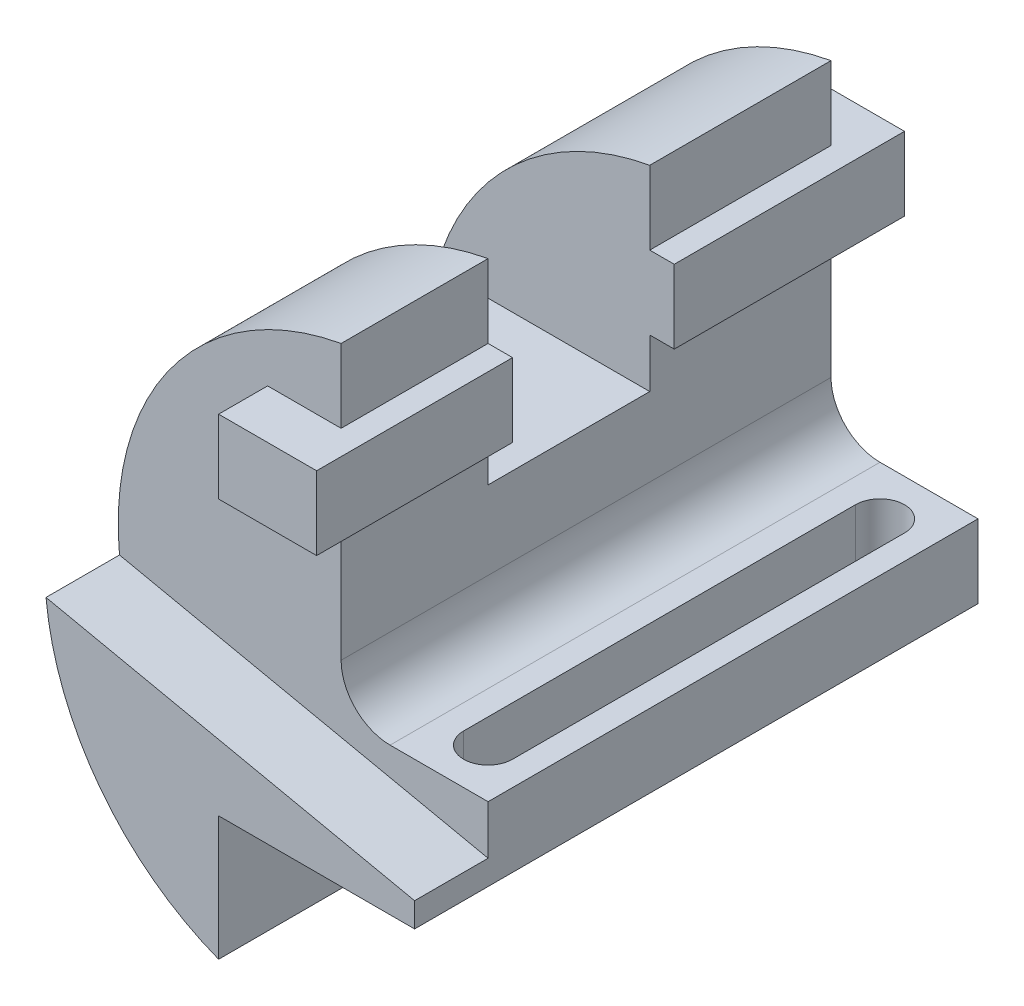
ISO-10303-21;
HEADER;
FILE_DESCRIPTION(('STEP AP214'),'2;1');
FILE_NAME('part.step','',(''),(''),'','','');
FILE_SCHEMA(('AUTOMOTIVE_DESIGN { 1 0 10303 214 1 1 1 1 }'));
ENDSEC;
DATA;
#1=APPLICATION_CONTEXT('core data for automotive mechanical design processes');
#2=APPLICATION_PROTOCOL_DEFINITION('international standard','automotive_design',2000,#1);
#3=PRODUCT_CONTEXT('',#1,'mechanical');
#4=PRODUCT('Part','Part','',(#3));
#5=PRODUCT_RELATED_PRODUCT_CATEGORY('part','',(#4));
#6=PRODUCT_DEFINITION_FORMATION('','',#4);
#7=PRODUCT_DEFINITION_CONTEXT('part definition',#1,'design');
#8=PRODUCT_DEFINITION('design','',#6,#7);
#9=PRODUCT_DEFINITION_SHAPE('','',#8);
#10=(LENGTH_UNIT() NAMED_UNIT(*) SI_UNIT(.MILLI.,.METRE.));
#11=(NAMED_UNIT(*) PLANE_ANGLE_UNIT() SI_UNIT($,.RADIAN.));
#12=(NAMED_UNIT(*) SI_UNIT($,.STERADIAN.) SOLID_ANGLE_UNIT());
#13=UNCERTAINTY_MEASURE_WITH_UNIT(LENGTH_MEASURE(1.E-05),#10,'distance_accuracy_value','');
#14=(GEOMETRIC_REPRESENTATION_CONTEXT(3) GLOBAL_UNCERTAINTY_ASSIGNED_CONTEXT((#13)) GLOBAL_UNIT_ASSIGNED_CONTEXT((#10,
#11,#12)) REPRESENTATION_CONTEXT('',''));
#15=CARTESIAN_POINT('',(0.,0.,0.));
#16=DIRECTION('',(0.,0.,1.));
#17=DIRECTION('',(1.,0.,0.));
#18=AXIS2_PLACEMENT_3D('',#15,#16,#17);
#19=CARTESIAN_POINT('',(-30.,15.,115.));
#20=DIRECTION('',(-1.,0.,0.));
#21=DIRECTION('',(0.,-1.,0.));
#22=AXIS2_PLACEMENT_3D('',#19,#20,#21);
#23=PLANE('',#22);
#24=DIRECTION('',(0.,0.,1.));
#25=VECTOR('',#24,1.);
#26=CARTESIAN_POINT('',(-30.,66.,115.));
#27=LINE('',#26,#25);
#28=CARTESIAN_POINT('',(-30.,66.,70.));
#29=VERTEX_POINT('',#28);
#30=CARTESIAN_POINT('',(-30.,66.,100.));
#31=VERTEX_POINT('',#30);
#32=EDGE_CURVE('E334',#29,#31,#27,.T.);
#33=ORIENTED_EDGE('',*,*,#32,.F.);
#34=DIRECTION('',(0.,1.,0.));
#35=VECTOR('',#34,1.);
#36=CARTESIAN_POINT('',(-30.,15.,70.));
#37=LINE('',#36,#35);
#38=CARTESIAN_POINT('',(-29.9999999999999,81.,70.));
#39=VERTEX_POINT('',#38);
#40=EDGE_CURVE('E285',#29,#39,#37,.T.);
#41=ORIENTED_EDGE('',*,*,#40,.T.);
#42=DIRECTION('',(0.,0.,-1.));
#43=VECTOR('',#42,1.);
#44=CARTESIAN_POINT('',(-30.,81.,115.));
#45=LINE('',#44,#43);
#46=CARTESIAN_POINT('',(-30.,81.,100.));
#47=VERTEX_POINT('',#46);
#48=EDGE_CURVE('E399',#47,#39,#45,.T.);
#49=ORIENTED_EDGE('',*,*,#48,.F.);
#50=DIRECTION('',(0.,1.,0.));
#51=VECTOR('',#50,1.);
#52=CARTESIAN_POINT('',(-30.,15.,100.));
#53=LINE('',#52,#51);
#54=EDGE_CURVE('E353',#31,#47,#53,.T.);
#55=ORIENTED_EDGE('',*,*,#54,.F.);
#56=EDGE_LOOP('',(#33,#41,#49,#55));
#57=FACE_BOUND('',#56,.T.);
#58=ADVANCED_FACE('F39',(#57),#23,.F.);
#59=CARTESIAN_POINT('',(-25.,51.,-10.));
#60=DIRECTION('',(0.,1.,0.));
#61=DIRECTION('',(-1.,0.,0.));
#62=AXIS2_PLACEMENT_3D('',#59,#60,#61);
#63=PLANE('',#62);
#64=DIRECTION('',(0.,0.,-1.));
#65=VECTOR('',#64,1.);
#66=CARTESIAN_POINT('',(-30.,51.,115.));
#67=LINE('',#66,#65);
#68=CARTESIAN_POINT('',(-30.,51.,100.));
#69=VERTEX_POINT('',#68);
#70=CARTESIAN_POINT('',(-30.,51.,70.));
#71=VERTEX_POINT('',#70);
#72=EDGE_CURVE('E343',#69,#71,#67,.T.);
#73=ORIENTED_EDGE('',*,*,#72,.T.);
#74=DIRECTION('',(1.,0.,0.));
#75=VECTOR('',#74,1.);
#76=CARTESIAN_POINT('',(-25.,51.,70.));
#77=LINE('',#76,#75);
#78=CARTESIAN_POINT('',(-25.,51.,70.));
#79=VERTEX_POINT('',#78);
#80=EDGE_CURVE('E282',#71,#79,#77,.T.);
#81=ORIENTED_EDGE('',*,*,#80,.T.);
#82=DIRECTION('',(0.,0.,1.));
#83=VECTOR('',#82,1.);
#84=CARTESIAN_POINT('',(-25.,51.,-10.));
#85=LINE('',#84,#83);
#86=CARTESIAN_POINT('',(-25.,51.,110.));
#87=VERTEX_POINT('',#86);
#88=EDGE_CURVE('E330',#79,#87,#85,.T.);
#89=ORIENTED_EDGE('',*,*,#88,.T.);
#90=DIRECTION('',(-1.,0.,0.));
#91=VECTOR('',#90,1.);
#92=CARTESIAN_POINT('',(-25.,51.,110.));
#93=LINE('',#92,#91);
#94=CARTESIAN_POINT('',(-45.,51.,110.));
#95=VERTEX_POINT('',#94);
#96=EDGE_CURVE('E297',#87,#95,#93,.T.);
#97=ORIENTED_EDGE('',*,*,#96,.T.);
#98=DIRECTION('',(0.,0.,1.));
#99=VECTOR('',#98,1.);
#100=CARTESIAN_POINT('',(-45.,51.,-10.));
#101=LINE('',#100,#99);
#102=CARTESIAN_POINT('',(-45.,51.,100.));
#103=VERTEX_POINT('',#102);
#104=EDGE_CURVE('E326',#103,#95,#101,.T.);
#105=ORIENTED_EDGE('',*,*,#104,.F.);
#106=DIRECTION('',(-1.,0.,0.));
#107=VECTOR('',#106,1.);
#108=CARTESIAN_POINT('',(-20.,51.,100.));
#109=LINE('',#108,#107);
#110=EDGE_CURVE('E413',#69,#103,#109,.T.);
#111=ORIENTED_EDGE('',*,*,#110,.F.);
#112=EDGE_LOOP('',(#73,#81,#89,#97,#105,#111));
#113=FACE_BOUND('',#112,.T.);
#114=ADVANCED_FACE('F509',(#113),#63,.F.);
#115=CARTESIAN_POINT('',(-25.,66.,-10.));
#116=DIRECTION('',(0.,-1.,0.));
#117=DIRECTION('',(0.,0.,-1.));
#118=AXIS2_PLACEMENT_3D('',#115,#116,#117);
#119=PLANE('',#118);
#120=DIRECTION('',(0.,0.,1.));
#121=VECTOR('',#120,1.);
#122=CARTESIAN_POINT('',(-25.,66.,-10.));
#123=LINE('',#122,#121);
#124=CARTESIAN_POINT('',(-25.,66.,70.));
#125=VERTEX_POINT('',#124);
#126=CARTESIAN_POINT('',(-25.,66.,110.));
#127=VERTEX_POINT('',#126);
#128=EDGE_CURVE('E318',#125,#127,#123,.T.);
#129=ORIENTED_EDGE('',*,*,#128,.F.);
#130=DIRECTION('',(-1.,0.,0.));
#131=VECTOR('',#130,1.);
#132=CARTESIAN_POINT('',(-25.,66.,70.));
#133=LINE('',#132,#131);
#134=EDGE_CURVE('E279',#125,#29,#133,.T.);
#135=ORIENTED_EDGE('',*,*,#134,.T.);
#136=ORIENTED_EDGE('',*,*,#32,.T.);
#137=DIRECTION('',(1.,0.,0.));
#138=VECTOR('',#137,1.);
#139=CARTESIAN_POINT('',(-20.,66.,100.));
#140=LINE('',#139,#138);
#141=CARTESIAN_POINT('',(-45.,66.,100.));
#142=VERTEX_POINT('',#141);
#143=EDGE_CURVE('E407',#142,#31,#140,.T.);
#144=ORIENTED_EDGE('',*,*,#143,.F.);
#145=DIRECTION('',(0.,0.,1.));
#146=VECTOR('',#145,1.);
#147=CARTESIAN_POINT('',(-45.,66.,-10.));
#148=LINE('',#147,#146);
#149=CARTESIAN_POINT('',(-45.,66.,110.));
#150=VERTEX_POINT('',#149);
#151=EDGE_CURVE('E322',#142,#150,#148,.T.);
#152=ORIENTED_EDGE('',*,*,#151,.T.);
#153=DIRECTION('',(1.,0.,0.));
#154=VECTOR('',#153,1.);
#155=CARTESIAN_POINT('',(-25.,66.,110.));
#156=LINE('',#155,#154);
#157=EDGE_CURVE('E305',#150,#127,#156,.T.);
#158=ORIENTED_EDGE('',*,*,#157,.T.);
#159=EDGE_LOOP('',(#129,#135,#136,#144,#152,#158));
#160=FACE_BOUND('',#159,.T.);
#161=ADVANCED_FACE('F515',(#160),#119,.F.);
#162=CARTESIAN_POINT('',(-25.,66.,-10.));
#163=DIRECTION('',(-1.,0.,0.));
#164=DIRECTION('',(0.,-1.,0.));
#165=AXIS2_PLACEMENT_3D('',#162,#163,#164);
#166=PLANE('',#165);
#167=ORIENTED_EDGE('',*,*,#88,.F.);
#168=DIRECTION('',(0.,1.,0.));
#169=VECTOR('',#168,1.);
#170=CARTESIAN_POINT('',(-25.,66.,70.));
#171=LINE('',#170,#169);
#172=EDGE_CURVE('E419',#79,#125,#171,.T.);
#173=ORIENTED_EDGE('',*,*,#172,.T.);
#174=ORIENTED_EDGE('',*,*,#128,.T.);
#175=DIRECTION('',(0.,-1.,0.));
#176=VECTOR('',#175,1.);
#177=CARTESIAN_POINT('',(-25.,66.,110.));
#178=LINE('',#177,#176);
#179=EDGE_CURVE('E301',#127,#87,#178,.T.);
#180=ORIENTED_EDGE('',*,*,#179,.T.);
#181=EDGE_LOOP('',(#167,#173,#174,#180));
#182=FACE_BOUND('',#181,.T.);
#183=ADVANCED_FACE('F523',(#182),#166,.F.);
#184=CARTESIAN_POINT('',(-30.,25.,100.));
#185=VERTEX_POINT('',#184);
#186=EDGE_CURVE('E354',#185,#69,#53,.T.);
#187=ORIENTED_EDGE('',*,*,#186,.F.);
#188=DIRECTION('',(0.,0.,-1.));
#189=VECTOR('',#188,1.);
#190=CARTESIAN_POINT('',(-30.,25.,0.));
#191=LINE('',#190,#189);
#192=CARTESIAN_POINT('',(-30.,25.,0.));
#193=VERTEX_POINT('',#192);
#194=EDGE_CURVE('E434',#185,#193,#191,.T.);
#195=ORIENTED_EDGE('',*,*,#194,.T.);
#196=DIRECTION('',(0.,1.,0.));
#197=VECTOR('',#196,1.);
#198=CARTESIAN_POINT('',(-30.,15.,0.));
#199=LINE('',#198,#197);
#200=CARTESIAN_POINT('',(-30.,51.,0.));
#201=VERTEX_POINT('',#200);
#202=EDGE_CURVE('E388',#193,#201,#199,.T.);
#203=ORIENTED_EDGE('',*,*,#202,.T.);
#204=CARTESIAN_POINT('',(-30.,51.,37.));
#205=VERTEX_POINT('',#204);
#206=EDGE_CURVE('E342',#205,#201,#67,.T.);
#207=ORIENTED_EDGE('',*,*,#206,.F.);
#208=DIRECTION('',(0.,-1.,0.));
#209=VECTOR('',#208,1.);
#210=CARTESIAN_POINT('',(-30.,15.,37.));
#211=LINE('',#210,#209);
#212=CARTESIAN_POINT('',(-30.,41.,37.));
#213=VERTEX_POINT('',#212);
#214=EDGE_CURVE('E273',#205,#213,#211,.T.);
#215=ORIENTED_EDGE('',*,*,#214,.T.);
#216=DIRECTION('',(0.,0.,1.));
#217=VECTOR('',#216,1.);
#218=CARTESIAN_POINT('',(-30.,41.,115.));
#219=LINE('',#218,#217);
#220=CARTESIAN_POINT('',(-30.,41.,70.));
#221=VERTEX_POINT('',#220);
#222=EDGE_CURVE('E294',#213,#221,#219,.T.);
#223=ORIENTED_EDGE('',*,*,#222,.T.);
#224=DIRECTION('',(0.,1.,0.));
#225=VECTOR('',#224,1.);
#226=CARTESIAN_POINT('',(-30.,15.,70.));
#227=LINE('',#226,#225);
#228=EDGE_CURVE('E288',#221,#71,#227,.T.);
#229=ORIENTED_EDGE('',*,*,#228,.T.);
#230=ORIENTED_EDGE('',*,*,#72,.F.);
#231=EDGE_LOOP('',(#187,#195,#203,#207,#215,#223,#229,#230));
#232=FACE_BOUND('',#231,.T.);
#233=ADVANCED_FACE('F440',(#232),#23,.F.);
#234=CARTESIAN_POINT('',(-29.9999999999999,81.,37.));
#235=VERTEX_POINT('',#234);
#236=CARTESIAN_POINT('',(-30.,81.,0.));
#237=VERTEX_POINT('',#236);
#238=EDGE_CURVE('E398',#235,#237,#45,.T.);
#239=ORIENTED_EDGE('',*,*,#238,.F.);
#240=DIRECTION('',(0.,-1.,0.));
#241=VECTOR('',#240,1.);
#242=CARTESIAN_POINT('',(-30.,15.,37.));
#243=LINE('',#242,#241);
#244=CARTESIAN_POINT('',(-30.,66.,37.));
#245=VERTEX_POINT('',#244);
#246=EDGE_CURVE('E270',#235,#245,#243,.T.);
#247=ORIENTED_EDGE('',*,*,#246,.T.);
#248=CARTESIAN_POINT('',(-30.,66.,0.));
#249=VERTEX_POINT('',#248);
#250=EDGE_CURVE('E335',#249,#245,#27,.T.);
#251=ORIENTED_EDGE('',*,*,#250,.F.);
#252=EDGE_CURVE('E387',#249,#237,#199,.T.);
#253=ORIENTED_EDGE('',*,*,#252,.T.);
#254=EDGE_LOOP('',(#239,#247,#251,#253));
#255=FACE_BOUND('',#254,.T.);
#256=ADVANCED_FACE('F474',(#255),#23,.F.);
#257=CARTESIAN_POINT('',(-20.,26.4083339693685,0.));
#258=DIRECTION('',(0.,0.,1.));
#259=DIRECTION('',(1.,0.,0.));
#260=AXIS2_PLACEMENT_3D('',#257,#258,#259);
#261=PLANE('',#260);
#262=DIRECTION('',(-1.,0.,0.));
#263=VECTOR('',#262,1.);
#264=CARTESIAN_POINT('',(-20.,51.,0.));
#265=LINE('',#264,#263);
#266=CARTESIAN_POINT('',(-45.,51.,0.));
#267=VERTEX_POINT('',#266);
#268=EDGE_CURVE('E346',#201,#267,#265,.T.);
#269=ORIENTED_EDGE('',*,*,#268,.F.);
#270=ORIENTED_EDGE('',*,*,#202,.F.);
#271=CARTESIAN_POINT('',(-20.,25.,0.));
#272=DIRECTION('',(0.,0.,1.));
#273=DIRECTION('',(1.,0.,0.));
#274=AXIS2_PLACEMENT_3D('',#271,#272,#273);
#275=CIRCLE('',#274,10.);
#276=CARTESIAN_POINT('',(-20.,15.,0.));
#277=VERTEX_POINT('',#276);
#278=EDGE_CURVE('E47',#193,#277,#275,.T.);
#279=ORIENTED_EDGE('',*,*,#278,.T.);
#280=DIRECTION('',(-1.,0.,0.));
#281=VECTOR('',#280,1.);
#282=CARTESIAN_POINT('',(0.,15.,0.));
#283=LINE('',#282,#281);
#284=CARTESIAN_POINT('',(0.,15.,0.));
#285=VERTEX_POINT('',#284);
#286=EDGE_CURVE('E385',#285,#277,#283,.T.);
#287=ORIENTED_EDGE('',*,*,#286,.F.);
#288=DIRECTION('',(0.,1.,0.));
#289=VECTOR('',#288,1.);
#290=CARTESIAN_POINT('',(0.,0.,0.));
#291=LINE('',#290,#289);
#292=CARTESIAN_POINT('',(0.,0.,0.));
#293=VERTEX_POINT('',#292);
#294=EDGE_CURVE('E382',#293,#285,#291,.T.);
#295=ORIENTED_EDGE('',*,*,#294,.F.);
#296=DIRECTION('',(1.,0.,0.));
#297=VECTOR('',#296,1.);
#298=CARTESIAN_POINT('',(0.,0.,0.));
#299=LINE('',#298,#297);
#300=CARTESIAN_POINT('',(-40.,0.,0.));
#301=VERTEX_POINT('',#300);
#302=EDGE_CURVE('E366',#301,#293,#299,.T.);
#303=ORIENTED_EDGE('',*,*,#302,.F.);
#304=DIRECTION('',(0.,1.,0.));
#305=VECTOR('',#304,1.);
#306=CARTESIAN_POINT('',(-40.,0.,0.));
#307=LINE('',#306,#305);
#308=CARTESIAN_POINT('',(-40.,-25.3627969821569,0.));
#309=VERTEX_POINT('',#308);
#310=EDGE_CURVE('E372',#309,#301,#307,.T.);
#311=ORIENTED_EDGE('',*,*,#310,.F.);
#312=CARTESIAN_POINT('',(-20.,26.4083339693685,0.));
#313=DIRECTION('',(0.,0.,1.));
#314=DIRECTION('',(1.,0.,0.));
#315=AXIS2_PLACEMENT_3D('',#312,#313,#314);
#316=CIRCLE('',#315,55.5);
#317=EDGE_CURVE('E390',#237,#309,#316,.T.);
#318=ORIENTED_EDGE('',*,*,#317,.F.);
#319=ORIENTED_EDGE('',*,*,#252,.F.);
#320=DIRECTION('',(1.,0.,0.));
#321=VECTOR('',#320,1.);
#322=CARTESIAN_POINT('',(-20.,66.,0.));
#323=LINE('',#322,#321);
#324=CARTESIAN_POINT('',(-45.,66.,0.));
#325=VERTEX_POINT('',#324);
#326=EDGE_CURVE('E338',#325,#249,#323,.T.);
#327=ORIENTED_EDGE('',*,*,#326,.F.);
#328=DIRECTION('',(0.,1.,0.));
#329=VECTOR('',#328,1.);
#330=CARTESIAN_POINT('',(-45.,26.4083339693685,0.));
#331=LINE('',#330,#329);
#332=EDGE_CURVE('E340',#267,#325,#331,.T.);
#333=ORIENTED_EDGE('',*,*,#332,.F.);
#334=EDGE_LOOP('',(#269,#270,#279,#287,#295,#303,#311,#318,#319,#327,#333));
#335=FACE_BOUND('',#334,.T.);
#336=ADVANCED_FACE('F447',(#335),#261,.F.);
#337=CARTESIAN_POINT('',(-20.,26.4083339693685,100.));
#338=DIRECTION('',(0.,0.,1.));
#339=DIRECTION('',(1.,0.,0.));
#340=AXIS2_PLACEMENT_3D('',#337,#338,#339);
#341=PLANE('',#340);
#342=DIRECTION('',(-1.,0.,0.));
#343=VECTOR('',#342,1.);
#344=CARTESIAN_POINT('',(0.,15.,100.));
#345=LINE('',#344,#343);
#346=CARTESIAN_POINT('',(0.,15.,100.));
#347=VERTEX_POINT('',#346);
#348=CARTESIAN_POINT('',(-20.,15.,100.));
#349=VERTEX_POINT('',#348);
#350=EDGE_CURVE('E351',#347,#349,#345,.T.);
#351=ORIENTED_EDGE('',*,*,#350,.T.);
#352=CARTESIAN_POINT('',(-20.,25.,100.));
#353=DIRECTION('',(0.,0.,1.));
#354=DIRECTION('',(1.,0.,0.));
#355=AXIS2_PLACEMENT_3D('',#352,#353,#354);
#356=CIRCLE('',#355,10.);
#357=EDGE_CURVE('E12',#349,#185,#356,.F.);
#358=ORIENTED_EDGE('',*,*,#357,.T.);
#359=ORIENTED_EDGE('',*,*,#186,.T.);
#360=ORIENTED_EDGE('',*,*,#110,.T.);
#361=DIRECTION('',(0.,1.,0.));
#362=VECTOR('',#361,1.);
#363=CARTESIAN_POINT('',(-45.,26.4083339693685,100.));
#364=LINE('',#363,#362);
#365=EDGE_CURVE('E410',#103,#142,#364,.T.);
#366=ORIENTED_EDGE('',*,*,#365,.T.);
#367=ORIENTED_EDGE('',*,*,#143,.T.);
#368=ORIENTED_EDGE('',*,*,#54,.T.);
#369=CARTESIAN_POINT('',(-20.,26.4083339693685,100.));
#370=DIRECTION('',(0.,0.,1.));
#371=DIRECTION('',(1.,0.,0.));
#372=AXIS2_PLACEMENT_3D('',#369,#370,#371);
#373=CIRCLE('',#372,55.5);
#374=CARTESIAN_POINT('',(-75.2350441418964,20.9917022998936,100.));
#375=VERTEX_POINT('',#374);
#376=EDGE_CURVE('E356',#47,#375,#373,.T.);
#377=ORIENTED_EDGE('',*,*,#376,.T.);
#378=DIRECTION('',(0.978147600733806,-0.207911690817756,0.));
#379=VECTOR('',#378,1.);
#380=CARTESIAN_POINT('',(0.,5.,100.));
#381=LINE('',#380,#379);
#382=CARTESIAN_POINT('',(0.,5.,100.));
#383=VERTEX_POINT('',#382);
#384=EDGE_CURVE('E358',#375,#383,#381,.T.);
#385=ORIENTED_EDGE('',*,*,#384,.T.);
#386=DIRECTION('',(0.,1.,0.));
#387=VECTOR('',#386,1.);
#388=CARTESIAN_POINT('',(0.,5.,100.));
#389=LINE('',#388,#387);
#390=EDGE_CURVE('E349',#383,#347,#389,.T.);
#391=ORIENTED_EDGE('',*,*,#390,.T.);
#392=EDGE_LOOP('',(#351,#358,#359,#360,#366,#367,#368,#377,#385,#391));
#393=FACE_BOUND('',#392,.T.);
#394=ADVANCED_FACE('F499',(#393),#341,.T.);
#395=CARTESIAN_POINT('',(0.,15.,115.));
#396=DIRECTION('',(0.,-1.,0.));
#397=DIRECTION('',(1.,0.,0.));
#398=AXIS2_PLACEMENT_3D('',#395,#396,#397);
#399=PLANE('',#398);
#400=DIRECTION('',(0.,0.,1.));
#401=VECTOR('',#400,1.);
#402=CARTESIAN_POINT('',(-15.,15.,10.));
#403=LINE('',#402,#401);
#404=CARTESIAN_POINT('',(-15.,15.,10.));
#405=VERTEX_POINT('',#404);
#406=CARTESIAN_POINT('',(-15.,15.,90.));
#407=VERTEX_POINT('',#406);
#408=EDGE_CURVE('E240',#405,#407,#403,.T.);
#409=ORIENTED_EDGE('',*,*,#408,.F.);
#410=CARTESIAN_POINT('',(-10.,15.,10.));
#411=DIRECTION('',(0.,1.,0.));
#412=DIRECTION('',(-1.,0.,0.));
#413=AXIS2_PLACEMENT_3D('',#410,#411,#412);
#414=CIRCLE('',#413,5.);
#415=CARTESIAN_POINT('',(-5.,15.,10.));
#416=VERTEX_POINT('',#415);
#417=EDGE_CURVE('E245',#416,#405,#414,.T.);
#418=ORIENTED_EDGE('',*,*,#417,.F.);
#419=DIRECTION('',(0.,0.,-1.));
#420=VECTOR('',#419,1.);
#421=CARTESIAN_POINT('',(-5.,15.,10.));
#422=LINE('',#421,#420);
#423=CARTESIAN_POINT('',(-5.00000000000001,15.,90.));
#424=VERTEX_POINT('',#423);
#425=EDGE_CURVE('E249',#424,#416,#422,.T.);
#426=ORIENTED_EDGE('',*,*,#425,.F.);
#427=CARTESIAN_POINT('',(-10.,15.,90.));
#428=DIRECTION('',(0.,1.,0.));
#429=DIRECTION('',(-1.,0.,0.));
#430=AXIS2_PLACEMENT_3D('',#427,#428,#429);
#431=CIRCLE('',#430,5.);
#432=EDGE_CURVE('E229',#407,#424,#431,.T.);
#433=ORIENTED_EDGE('',*,*,#432,.F.);
#434=EDGE_LOOP('',(#409,#418,#426,#433));
#435=FACE_BOUND('',#434,.T.);
#436=ORIENTED_EDGE('',*,*,#286,.T.);
#437=DIRECTION('',(0.,0.,-1.));
#438=VECTOR('',#437,1.);
#439=CARTESIAN_POINT('',(-20.,15.,100.));
#440=LINE('',#439,#438);
#441=EDGE_CURVE('E60',#277,#349,#440,.F.);
#442=ORIENTED_EDGE('',*,*,#441,.T.);
#443=ORIENTED_EDGE('',*,*,#350,.F.);
#444=DIRECTION('',(0.,0.,-1.));
#445=VECTOR('',#444,1.);
#446=CARTESIAN_POINT('',(0.,15.,115.));
#447=LINE('',#446,#445);
#448=EDGE_CURVE('E402',#347,#285,#447,.T.);
#449=ORIENTED_EDGE('',*,*,#448,.T.);
#450=EDGE_LOOP('',(#436,#442,#443,#449));
#451=FACE_BOUND('',#450,.T.);
#452=ADVANCED_FACE('F247',(#435,#451),#399,.F.);
#453=CARTESIAN_POINT('',(0.,0.,115.));
#454=DIRECTION('',(0.,1.,0.));
#455=DIRECTION('',(-1.,0.,0.));
#456=AXIS2_PLACEMENT_3D('',#453,#454,#455);
#457=PLANE('',#456);
#458=DIRECTION('',(0.,0.,-1.));
#459=VECTOR('',#458,1.);
#460=CARTESIAN_POINT('',(-5.00000000000001,0.,115.));
#461=LINE('',#460,#459);
#462=CARTESIAN_POINT('',(-5.00000000000001,0.,90.));
#463=VERTEX_POINT('',#462);
#464=CARTESIAN_POINT('',(-5.,0.,10.));
#465=VERTEX_POINT('',#464);
#466=EDGE_CURVE('E428',#463,#465,#461,.T.);
#467=ORIENTED_EDGE('',*,*,#466,.T.);
#468=CARTESIAN_POINT('',(-10.,0.,10.));
#469=DIRECTION('',(0.,1.,0.));
#470=DIRECTION('',(-1.,0.,0.));
#471=AXIS2_PLACEMENT_3D('',#468,#469,#470);
#472=CIRCLE('',#471,5.);
#473=CARTESIAN_POINT('',(-15.,0.,10.));
#474=VERTEX_POINT('',#473);
#475=EDGE_CURVE('E431',#465,#474,#472,.T.);
#476=ORIENTED_EDGE('',*,*,#475,.T.);
#477=DIRECTION('',(0.,0.,1.));
#478=VECTOR('',#477,1.);
#479=CARTESIAN_POINT('',(-15.,0.,115.));
#480=LINE('',#479,#478);
#481=CARTESIAN_POINT('',(-15.,0.,90.));
#482=VERTEX_POINT('',#481);
#483=EDGE_CURVE('E425',#474,#482,#480,.T.);
#484=ORIENTED_EDGE('',*,*,#483,.T.);
#485=CARTESIAN_POINT('',(-10.,0.,90.));
#486=DIRECTION('',(0.,1.,0.));
#487=DIRECTION('',(-1.,0.,0.));
#488=AXIS2_PLACEMENT_3D('',#485,#486,#487);
#489=CIRCLE('',#488,5.);
#490=EDGE_CURVE('E232',#482,#463,#489,.T.);
#491=ORIENTED_EDGE('',*,*,#490,.T.);
#492=EDGE_LOOP('',(#467,#476,#484,#491));
#493=FACE_BOUND('',#492,.T.);
#494=ORIENTED_EDGE('',*,*,#302,.T.);
#495=DIRECTION('',(0.,0.,-1.));
#496=VECTOR('',#495,1.);
#497=CARTESIAN_POINT('',(0.,0.,115.));
#498=LINE('',#497,#496);
#499=CARTESIAN_POINT('',(0.,0.,115.));
#500=VERTEX_POINT('',#499);
#501=EDGE_CURVE('E404',#500,#293,#498,.T.);
#502=ORIENTED_EDGE('',*,*,#501,.F.);
#503=DIRECTION('',(1.,0.,0.));
#504=VECTOR('',#503,1.);
#505=CARTESIAN_POINT('',(0.,0.,115.));
#506=LINE('',#505,#504);
#507=CARTESIAN_POINT('',(-40.,0.,115.));
#508=VERTEX_POINT('',#507);
#509=EDGE_CURVE('E368',#508,#500,#506,.T.);
#510=ORIENTED_EDGE('',*,*,#509,.F.);
#511=DIRECTION('',(0.,0.,-1.));
#512=VECTOR('',#511,1.);
#513=CARTESIAN_POINT('',(-40.,0.,115.));
#514=LINE('',#513,#512);
#515=EDGE_CURVE('E379',#508,#301,#514,.T.);
#516=ORIENTED_EDGE('',*,*,#515,.T.);
#517=EDGE_LOOP('',(#494,#502,#510,#516));
#518=FACE_BOUND('',#517,.T.);
#519=ADVANCED_FACE('F566',(#493,#518),#457,.F.);
#520=CARTESIAN_POINT('',(0.,0.,115.));
#521=DIRECTION('',(-1.,0.,0.));
#522=DIRECTION('',(0.,0.,1.));
#523=AXIS2_PLACEMENT_3D('',#520,#521,#522);
#524=PLANE('',#523);
#525=ORIENTED_EDGE('',*,*,#390,.F.);
#526=DIRECTION('',(0.,0.,1.));
#527=VECTOR('',#526,1.);
#528=CARTESIAN_POINT('',(0.,5.,100.));
#529=LINE('',#528,#527);
#530=CARTESIAN_POINT('',(0.,5.,115.));
#531=VERTEX_POINT('',#530);
#532=EDGE_CURVE('E363',#383,#531,#529,.T.);
#533=ORIENTED_EDGE('',*,*,#532,.T.);
#534=DIRECTION('',(0.,1.,0.));
#535=VECTOR('',#534,1.);
#536=CARTESIAN_POINT('',(0.,0.,115.));
#537=LINE('',#536,#535);
#538=EDGE_CURVE('E371',#500,#531,#537,.T.);
#539=ORIENTED_EDGE('',*,*,#538,.F.);
#540=ORIENTED_EDGE('',*,*,#501,.T.);
#541=ORIENTED_EDGE('',*,*,#294,.T.);
#542=ORIENTED_EDGE('',*,*,#448,.F.);
#543=EDGE_LOOP('',(#525,#533,#539,#540,#541,#542));
#544=FACE_BOUND('',#543,.T.);
#545=ADVANCED_FACE('F502',(#544),#524,.F.);
#546=CARTESIAN_POINT('',(-20.,26.4083339693685,115.));
#547=DIRECTION('',(0.,0.,-1.));
#548=DIRECTION('',(-1.,0.,0.));
#549=AXIS2_PLACEMENT_3D('',#546,#547,#548);
#550=CYLINDRICAL_SURFACE('',#549,55.5);
#551=ORIENTED_EDGE('',*,*,#48,.T.);
#552=CARTESIAN_POINT('',(-20.,26.4083339693685,70.));
#553=DIRECTION('',(0.,0.,1.));
#554=DIRECTION('',(1.,0.,0.));
#555=AXIS2_PLACEMENT_3D('',#552,#553,#554);
#556=CIRCLE('',#555,55.5);
#557=CARTESIAN_POINT('',(-73.5474862383895,41.,70.));
#558=VERTEX_POINT('',#557);
#559=EDGE_CURVE('E291',#39,#558,#556,.T.);
#560=ORIENTED_EDGE('',*,*,#559,.T.);
#561=DIRECTION('',(0.,0.,-1.));
#562=VECTOR('',#561,1.);
#563=CARTESIAN_POINT('',(-73.5474862383895,41.,115.));
#564=LINE('',#563,#562);
#565=CARTESIAN_POINT('',(-73.5474862383895,41.,37.));
#566=VERTEX_POINT('',#565);
#567=EDGE_CURVE('E422',#558,#566,#564,.T.);
#568=ORIENTED_EDGE('',*,*,#567,.T.);
#569=CARTESIAN_POINT('',(-20.,26.4083339693685,37.));
#570=DIRECTION('',(0.,0.,-1.));
#571=DIRECTION('',(-1.,0.,0.));
#572=AXIS2_PLACEMENT_3D('',#569,#570,#571);
#573=CIRCLE('',#572,55.5);
#574=EDGE_CURVE('E276',#566,#235,#573,.T.);
#575=ORIENTED_EDGE('',*,*,#574,.T.);
#576=ORIENTED_EDGE('',*,*,#238,.T.);
#577=ORIENTED_EDGE('',*,*,#317,.T.);
#578=DIRECTION('',(0.,0.,-1.));
#579=VECTOR('',#578,1.);
#580=CARTESIAN_POINT('',(-40.,-25.3627969821569,115.));
#581=LINE('',#580,#579);
#582=CARTESIAN_POINT('',(-40.,-25.3627969821569,115.));
#583=VERTEX_POINT('',#582);
#584=EDGE_CURVE('E395',#583,#309,#581,.T.);
#585=ORIENTED_EDGE('',*,*,#584,.F.);
#586=CARTESIAN_POINT('',(-20.,26.4083339693685,115.));
#587=DIRECTION('',(0.,0.,1.));
#588=DIRECTION('',(1.,0.,0.));
#589=AXIS2_PLACEMENT_3D('',#586,#587,#588);
#590=CIRCLE('',#589,55.5);
#591=CARTESIAN_POINT('',(-75.2350441418964,20.9917022998936,115.));
#592=VERTEX_POINT('',#591);
#593=EDGE_CURVE('E375',#592,#583,#590,.T.);
#594=ORIENTED_EDGE('',*,*,#593,.F.);
#595=DIRECTION('',(0.,0.,1.));
#596=VECTOR('',#595,1.);
#597=CARTESIAN_POINT('',(-75.2350441418964,20.9917022998936,100.));
#598=LINE('',#597,#596);
#599=EDGE_CURVE('E361',#375,#592,#598,.T.);
#600=ORIENTED_EDGE('',*,*,#599,.F.);
#601=ORIENTED_EDGE('',*,*,#376,.F.);
#602=EDGE_LOOP('',(#551,#560,#568,#575,#576,#577,#585,#594,#600,#601));
#603=FACE_BOUND('',#602,.T.);
#604=ADVANCED_FACE('F480',(#603),#550,.T.);
#605=CARTESIAN_POINT('',(-40.,0.,115.));
#606=DIRECTION('',(-1.,0.,0.));
#607=DIRECTION('',(0.,-1.,0.));
#608=AXIS2_PLACEMENT_3D('',#605,#606,#607);
#609=PLANE('',#608);
#610=ORIENTED_EDGE('',*,*,#310,.T.);
#611=ORIENTED_EDGE('',*,*,#515,.F.);
#612=DIRECTION('',(0.,1.,0.));
#613=VECTOR('',#612,1.);
#614=CARTESIAN_POINT('',(-40.,0.,115.));
#615=LINE('',#614,#613);
#616=EDGE_CURVE('E377',#583,#508,#615,.T.);
#617=ORIENTED_EDGE('',*,*,#616,.F.);
#618=ORIENTED_EDGE('',*,*,#584,.T.);
#619=EDGE_LOOP('',(#610,#611,#617,#618));
#620=FACE_BOUND('',#619,.T.);
#621=ADVANCED_FACE('F484',(#620),#609,.F.);
#622=CARTESIAN_POINT('',(-20.,26.4083339693685,115.));
#623=DIRECTION('',(0.,0.,1.));
#624=DIRECTION('',(1.,0.,0.));
#625=AXIS2_PLACEMENT_3D('',#622,#623,#624);
#626=PLANE('',#625);
#627=DIRECTION('',(0.978147600733806,-0.207911690817756,0.));
#628=VECTOR('',#627,1.);
#629=CARTESIAN_POINT('',(0.,5.,115.));
#630=LINE('',#629,#628);
#631=EDGE_CURVE('E348',#592,#531,#630,.T.);
#632=ORIENTED_EDGE('',*,*,#631,.F.);
#633=ORIENTED_EDGE('',*,*,#593,.T.);
#634=ORIENTED_EDGE('',*,*,#616,.T.);
#635=ORIENTED_EDGE('',*,*,#509,.T.);
#636=ORIENTED_EDGE('',*,*,#538,.T.);
#637=EDGE_LOOP('',(#632,#633,#634,#635,#636));
#638=FACE_BOUND('',#637,.T.);
#639=ADVANCED_FACE('F489',(#638),#626,.T.);
#640=CARTESIAN_POINT('',(0.,5.,100.));
#641=DIRECTION('',(-0.207911690817756,-0.978147600733806,0.));
#642=DIRECTION('',(0.978147600733807,-0.207911690817756,0.));
#643=AXIS2_PLACEMENT_3D('',#640,#641,#642);
#644=PLANE('',#643);
#645=ORIENTED_EDGE('',*,*,#631,.T.);
#646=ORIENTED_EDGE('',*,*,#532,.F.);
#647=ORIENTED_EDGE('',*,*,#384,.F.);
#648=ORIENTED_EDGE('',*,*,#599,.T.);
#649=EDGE_LOOP('',(#645,#646,#647,#648));
#650=FACE_BOUND('',#649,.T.);
#651=ADVANCED_FACE('F496',(#650),#644,.F.);
#652=CARTESIAN_POINT('',(-25.,51.,-10.));
#653=VERTEX_POINT('',#652);
#654=CARTESIAN_POINT('',(-25.,51.,37.));
#655=VERTEX_POINT('',#654);
#656=EDGE_CURVE('E331',#653,#655,#85,.T.);
#657=ORIENTED_EDGE('',*,*,#656,.T.);
#658=DIRECTION('',(-1.,0.,0.));
#659=VECTOR('',#658,1.);
#660=CARTESIAN_POINT('',(-25.,51.,37.));
#661=LINE('',#660,#659);
#662=EDGE_CURVE('E267',#655,#205,#661,.T.);
#663=ORIENTED_EDGE('',*,*,#662,.T.);
#664=ORIENTED_EDGE('',*,*,#206,.T.);
#665=ORIENTED_EDGE('',*,*,#268,.T.);
#666=CARTESIAN_POINT('',(-45.,51.,-10.));
#667=VERTEX_POINT('',#666);
#668=EDGE_CURVE('E327',#667,#267,#101,.T.);
#669=ORIENTED_EDGE('',*,*,#668,.F.);
#670=DIRECTION('',(-1.,0.,0.));
#671=VECTOR('',#670,1.);
#672=CARTESIAN_POINT('',(-25.,51.,-10.));
#673=LINE('',#672,#671);
#674=EDGE_CURVE('E312',#653,#667,#673,.T.);
#675=ORIENTED_EDGE('',*,*,#674,.F.);
#676=EDGE_LOOP('',(#657,#663,#664,#665,#669,#675));
#677=FACE_BOUND('',#676,.T.);
#678=ADVANCED_FACE('F452',(#677),#63,.F.);
#679=CARTESIAN_POINT('',(-45.,66.,-10.));
#680=DIRECTION('',(1.,0.,0.));
#681=DIRECTION('',(0.,0.,-1.));
#682=AXIS2_PLACEMENT_3D('',#679,#680,#681);
#683=PLANE('',#682);
#684=ORIENTED_EDGE('',*,*,#668,.T.);
#685=ORIENTED_EDGE('',*,*,#332,.T.);
#686=CARTESIAN_POINT('',(-45.,66.,-10.));
#687=VERTEX_POINT('',#686);
#688=EDGE_CURVE('E323',#687,#325,#148,.T.);
#689=ORIENTED_EDGE('',*,*,#688,.F.);
#690=DIRECTION('',(0.,1.,0.));
#691=VECTOR('',#690,1.);
#692=CARTESIAN_POINT('',(-45.,66.,-10.));
#693=LINE('',#692,#691);
#694=EDGE_CURVE('E314',#667,#687,#693,.T.);
#695=ORIENTED_EDGE('',*,*,#694,.F.);
#696=EDGE_LOOP('',(#684,#685,#689,#695));
#697=FACE_BOUND('',#696,.T.);
#698=ADVANCED_FACE('F455',(#697),#683,.F.);
#699=ORIENTED_EDGE('',*,*,#250,.T.);
#700=DIRECTION('',(1.,0.,0.));
#701=VECTOR('',#700,1.);
#702=CARTESIAN_POINT('',(-25.,66.,37.));
#703=LINE('',#702,#701);
#704=CARTESIAN_POINT('',(-25.,66.,37.));
#705=VERTEX_POINT('',#704);
#706=EDGE_CURVE('E262',#245,#705,#703,.T.);
#707=ORIENTED_EDGE('',*,*,#706,.T.);
#708=CARTESIAN_POINT('',(-25.,66.,-10.));
#709=VERTEX_POINT('',#708);
#710=EDGE_CURVE('E319',#709,#705,#123,.T.);
#711=ORIENTED_EDGE('',*,*,#710,.F.);
#712=DIRECTION('',(1.,0.,0.));
#713=VECTOR('',#712,1.);
#714=CARTESIAN_POINT('',(-25.,66.,-10.));
#715=LINE('',#714,#713);
#716=EDGE_CURVE('E316',#687,#709,#715,.T.);
#717=ORIENTED_EDGE('',*,*,#716,.F.);
#718=ORIENTED_EDGE('',*,*,#688,.T.);
#719=ORIENTED_EDGE('',*,*,#326,.T.);
#720=EDGE_LOOP('',(#699,#707,#711,#717,#718,#719));
#721=FACE_BOUND('',#720,.T.);
#722=ADVANCED_FACE('F468',(#721),#119,.F.);
#723=ORIENTED_EDGE('',*,*,#710,.T.);
#724=DIRECTION('',(0.,-1.,0.));
#725=VECTOR('',#724,1.);
#726=CARTESIAN_POINT('',(-25.,66.,37.));
#727=LINE('',#726,#725);
#728=EDGE_CURVE('E416',#705,#655,#727,.T.);
#729=ORIENTED_EDGE('',*,*,#728,.T.);
#730=ORIENTED_EDGE('',*,*,#656,.F.);
#731=DIRECTION('',(0.,-1.,0.));
#732=VECTOR('',#731,1.);
#733=CARTESIAN_POINT('',(-25.,66.,-10.));
#734=LINE('',#733,#732);
#735=EDGE_CURVE('E304',#709,#653,#734,.T.);
#736=ORIENTED_EDGE('',*,*,#735,.F.);
#737=EDGE_LOOP('',(#723,#729,#730,#736));
#738=FACE_BOUND('',#737,.T.);
#739=ADVANCED_FACE('F464',(#738),#166,.F.);
#740=ORIENTED_EDGE('',*,*,#365,.F.);
#741=ORIENTED_EDGE('',*,*,#104,.T.);
#742=DIRECTION('',(0.,1.,0.));
#743=VECTOR('',#742,1.);
#744=CARTESIAN_POINT('',(-45.,66.,110.));
#745=LINE('',#744,#743);
#746=EDGE_CURVE('E300',#95,#150,#745,.T.);
#747=ORIENTED_EDGE('',*,*,#746,.T.);
#748=ORIENTED_EDGE('',*,*,#151,.F.);
#749=EDGE_LOOP('',(#740,#741,#747,#748));
#750=FACE_BOUND('',#749,.T.);
#751=ADVANCED_FACE('F537',(#750),#683,.F.);
#752=CARTESIAN_POINT('',(0.,0.,-10.));
#753=DIRECTION('',(0.,0.,-1.));
#754=DIRECTION('',(-1.,0.,0.));
#755=AXIS2_PLACEMENT_3D('',#752,#753,#754);
#756=PLANE('',#755);
#757=ORIENTED_EDGE('',*,*,#735,.T.);
#758=ORIENTED_EDGE('',*,*,#674,.T.);
#759=ORIENTED_EDGE('',*,*,#694,.T.);
#760=ORIENTED_EDGE('',*,*,#716,.T.);
#761=EDGE_LOOP('',(#757,#758,#759,#760));
#762=FACE_BOUND('',#761,.T.);
#763=ADVANCED_FACE('F459',(#762),#756,.T.);
#764=CARTESIAN_POINT('',(-20.,26.4083339693685,110.));
#765=DIRECTION('',(0.,0.,1.));
#766=DIRECTION('',(1.,0.,0.));
#767=AXIS2_PLACEMENT_3D('',#764,#765,#766);
#768=PLANE('',#767);
#769=ORIENTED_EDGE('',*,*,#179,.F.);
#770=ORIENTED_EDGE('',*,*,#157,.F.);
#771=ORIENTED_EDGE('',*,*,#746,.F.);
#772=ORIENTED_EDGE('',*,*,#96,.F.);
#773=EDGE_LOOP('',(#769,#770,#771,#772));
#774=FACE_BOUND('',#773,.T.);
#775=ADVANCED_FACE('F621',(#774),#768,.T.);
#776=CARTESIAN_POINT('',(-75.5,41.,70.));
#777=DIRECTION('',(0.,-1.,0.));
#778=DIRECTION('',(1.,0.,0.));
#779=AXIS2_PLACEMENT_3D('',#776,#777,#778);
#780=PLANE('',#779);
#781=DIRECTION('',(1.,0.,0.));
#782=VECTOR('',#781,1.);
#783=CARTESIAN_POINT('',(-75.5,41.,37.));
#784=LINE('',#783,#782);
#785=EDGE_CURVE('E259',#566,#213,#784,.T.);
#786=ORIENTED_EDGE('',*,*,#785,.F.);
#787=ORIENTED_EDGE('',*,*,#567,.F.);
#788=DIRECTION('',(1.,0.,0.));
#789=VECTOR('',#788,1.);
#790=CARTESIAN_POINT('',(-75.5,41.,70.));
#791=LINE('',#790,#789);
#792=EDGE_CURVE('E256',#558,#221,#791,.T.);
#793=ORIENTED_EDGE('',*,*,#792,.T.);
#794=ORIENTED_EDGE('',*,*,#222,.F.);
#795=EDGE_LOOP('',(#786,#787,#793,#794));
#796=FACE_BOUND('',#795,.T.);
#797=ADVANCED_FACE('F615',(#796),#780,.F.);
#798=CARTESIAN_POINT('',(-75.5,81.,70.));
#799=DIRECTION('',(0.,0.,1.));
#800=DIRECTION('',(1.,0.,0.));
#801=AXIS2_PLACEMENT_3D('',#798,#799,#800);
#802=PLANE('',#801);
#803=ORIENTED_EDGE('',*,*,#40,.F.);
#804=ORIENTED_EDGE('',*,*,#134,.F.);
#805=ORIENTED_EDGE('',*,*,#172,.F.);
#806=ORIENTED_EDGE('',*,*,#80,.F.);
#807=ORIENTED_EDGE('',*,*,#228,.F.);
#808=ORIENTED_EDGE('',*,*,#792,.F.);
#809=ORIENTED_EDGE('',*,*,#559,.F.);
#810=EDGE_LOOP('',(#803,#804,#805,#806,#807,#808,#809));
#811=FACE_BOUND('',#810,.T.);
#812=ADVANCED_FACE('F620',(#811),#802,.F.);
#813=CARTESIAN_POINT('',(-75.5,81.,37.));
#814=DIRECTION('',(0.,0.,-1.));
#815=DIRECTION('',(-1.,0.,0.));
#816=AXIS2_PLACEMENT_3D('',#813,#814,#815);
#817=PLANE('',#816);
#818=ORIENTED_EDGE('',*,*,#785,.T.);
#819=ORIENTED_EDGE('',*,*,#214,.F.);
#820=ORIENTED_EDGE('',*,*,#662,.F.);
#821=ORIENTED_EDGE('',*,*,#728,.F.);
#822=ORIENTED_EDGE('',*,*,#706,.F.);
#823=ORIENTED_EDGE('',*,*,#246,.F.);
#824=ORIENTED_EDGE('',*,*,#574,.F.);
#825=EDGE_LOOP('',(#818,#819,#820,#821,#822,#823,#824));
#826=FACE_BOUND('',#825,.T.);
#827=ADVANCED_FACE('F466',(#826),#817,.F.);
#828=CARTESIAN_POINT('',(-9.99999999999999,-25.3627969821569,10.));
#829=DIRECTION('',(0.,1.,0.));
#830=DIRECTION('',(-1.,0.,0.));
#831=AXIS2_PLACEMENT_3D('',#828,#829,#830);
#832=CYLINDRICAL_SURFACE('',#831,5.);
#833=DIRECTION('',(0.,1.,0.));
#834=VECTOR('',#833,1.);
#835=CARTESIAN_POINT('',(-4.99999999999999,-25.3627969821569,10.));
#836=LINE('',#835,#834);
#837=EDGE_CURVE('E254',#465,#416,#836,.T.);
#838=ORIENTED_EDGE('',*,*,#837,.T.);
#839=ORIENTED_EDGE('',*,*,#417,.T.);
#840=DIRECTION('',(0.,1.,0.));
#841=VECTOR('',#840,1.);
#842=CARTESIAN_POINT('',(-15.,-25.3627969821569,10.));
#843=LINE('',#842,#841);
#844=EDGE_CURVE('E236',#474,#405,#843,.T.);
#845=ORIENTED_EDGE('',*,*,#844,.F.);
#846=ORIENTED_EDGE('',*,*,#475,.F.);
#847=EDGE_LOOP('',(#838,#839,#845,#846));
#848=FACE_BOUND('',#847,.T.);
#849=ADVANCED_FACE('F642',(#848),#832,.F.);
#850=CARTESIAN_POINT('',(-4.99999999999999,-25.3627969821569,10.));
#851=DIRECTION('',(1.,0.,0.));
#852=DIRECTION('',(0.,1.,0.));
#853=AXIS2_PLACEMENT_3D('',#850,#851,#852);
#854=PLANE('',#853);
#855=DIRECTION('',(0.,1.,0.));
#856=VECTOR('',#855,1.);
#857=CARTESIAN_POINT('',(-5.,-25.3627969821569,90.));
#858=LINE('',#857,#856);
#859=EDGE_CURVE('E235',#463,#424,#858,.T.);
#860=ORIENTED_EDGE('',*,*,#859,.T.);
#861=ORIENTED_EDGE('',*,*,#425,.T.);
#862=ORIENTED_EDGE('',*,*,#837,.F.);
#863=ORIENTED_EDGE('',*,*,#466,.F.);
#864=EDGE_LOOP('',(#860,#861,#862,#863));
#865=FACE_BOUND('',#864,.T.);
#866=ADVANCED_FACE('F657',(#865),#854,.F.);
#867=CARTESIAN_POINT('',(-10.,-25.3627969821569,90.));
#868=DIRECTION('',(0.,1.,0.));
#869=DIRECTION('',(-1.,0.,0.));
#870=AXIS2_PLACEMENT_3D('',#867,#868,#869);
#871=CYLINDRICAL_SURFACE('',#870,5.);
#872=DIRECTION('',(0.,1.,0.));
#873=VECTOR('',#872,1.);
#874=CARTESIAN_POINT('',(-15.,-25.3627969821569,90.));
#875=LINE('',#874,#873);
#876=EDGE_CURVE('E224',#482,#407,#875,.T.);
#877=ORIENTED_EDGE('',*,*,#876,.T.);
#878=ORIENTED_EDGE('',*,*,#432,.T.);
#879=ORIENTED_EDGE('',*,*,#859,.F.);
#880=ORIENTED_EDGE('',*,*,#490,.F.);
#881=EDGE_LOOP('',(#877,#878,#879,#880));
#882=FACE_BOUND('',#881,.T.);
#883=ADVANCED_FACE('F226',(#882),#871,.F.);
#884=CARTESIAN_POINT('',(-15.,-25.3627969821569,10.));
#885=DIRECTION('',(-1.,0.,0.));
#886=DIRECTION('',(0.,-1.,0.));
#887=AXIS2_PLACEMENT_3D('',#884,#885,#886);
#888=PLANE('',#887);
#889=ORIENTED_EDGE('',*,*,#844,.T.);
#890=ORIENTED_EDGE('',*,*,#408,.T.);
#891=ORIENTED_EDGE('',*,*,#876,.F.);
#892=ORIENTED_EDGE('',*,*,#483,.F.);
#893=EDGE_LOOP('',(#889,#890,#891,#892));
#894=FACE_BOUND('',#893,.T.);
#895=ADVANCED_FACE('F241',(#894),#888,.F.);
#896=CARTESIAN_POINT('',(-20.,25.,115.));
#897=DIRECTION('',(0.,0.,1.));
#898=DIRECTION('',(1.,0.,0.));
#899=AXIS2_PLACEMENT_3D('',#896,#897,#898);
#900=CYLINDRICAL_SURFACE('',#899,10.);
#901=ORIENTED_EDGE('',*,*,#357,.F.);
#902=ORIENTED_EDGE('',*,*,#441,.F.);
#903=ORIENTED_EDGE('',*,*,#278,.F.);
#904=ORIENTED_EDGE('',*,*,#194,.F.);
#905=EDGE_LOOP('',(#901,#902,#903,#904));
#906=FACE_BOUND('',#905,.T.);
#907=ADVANCED_FACE('F41',(#906),#900,.F.);
#908=CLOSED_SHELL('',(#58,#114,#161,#183,#233,#256,#336,#394,#452,#519,#545,#604,#621,#639,#651,
#678,#698,#722,#739,#751,#763,#775,#797,#812,#827,#849,#866,#883,#895,#907));
#909=MANIFOLD_SOLID_BREP('B2',#908);
#910=ADVANCED_BREP_SHAPE_REPRESENTATION('',(#18,#909),#14);
#911=SHAPE_DEFINITION_REPRESENTATION(#9,#910);
ENDSEC;
END-ISO-10303-21;
